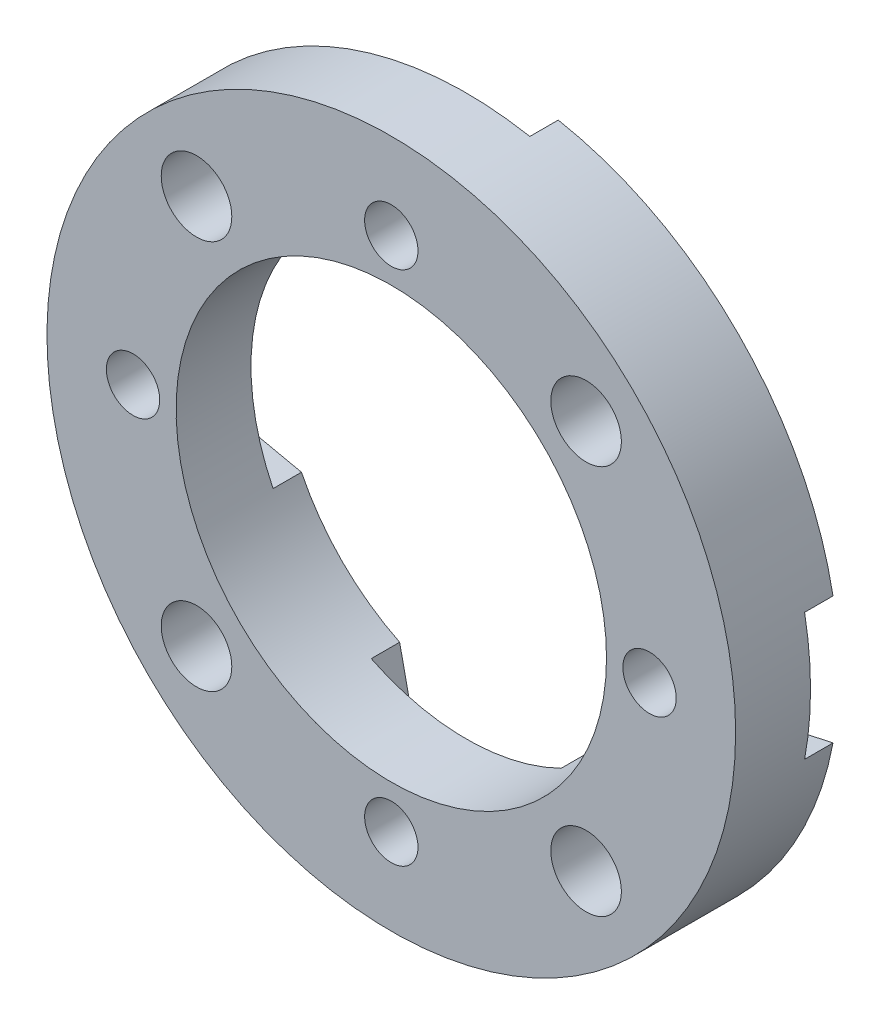
ISO-10303-21;
HEADER;
FILE_DESCRIPTION(('STEP AP214'),'2;1');
FILE_NAME('part.step','',(''),(''),'','','');
FILE_SCHEMA(('AUTOMOTIVE_DESIGN { 1 0 10303 214 1 1 1 1 }'));
ENDSEC;
DATA;
#1=APPLICATION_CONTEXT('core data for automotive mechanical design processes');
#2=APPLICATION_PROTOCOL_DEFINITION('international standard','automotive_design',2000,#1);
#3=PRODUCT_CONTEXT('',#1,'mechanical');
#4=PRODUCT('Part','Part','',(#3));
#5=PRODUCT_RELATED_PRODUCT_CATEGORY('part','',(#4));
#6=PRODUCT_DEFINITION_FORMATION('','',#4);
#7=PRODUCT_DEFINITION_CONTEXT('part definition',#1,'design');
#8=PRODUCT_DEFINITION('design','',#6,#7);
#9=PRODUCT_DEFINITION_SHAPE('','',#8);
#10=(LENGTH_UNIT() NAMED_UNIT(*) SI_UNIT(.MILLI.,.METRE.));
#11=(NAMED_UNIT(*) PLANE_ANGLE_UNIT() SI_UNIT($,.RADIAN.));
#12=(NAMED_UNIT(*) SI_UNIT($,.STERADIAN.) SOLID_ANGLE_UNIT());
#13=UNCERTAINTY_MEASURE_WITH_UNIT(LENGTH_MEASURE(1.E-05),#10,'distance_accuracy_value','');
#14=(GEOMETRIC_REPRESENTATION_CONTEXT(3) GLOBAL_UNCERTAINTY_ASSIGNED_CONTEXT((#13)) GLOBAL_UNIT_ASSIGNED_CONTEXT((#10,
#11,#12)) REPRESENTATION_CONTEXT('',''));
#15=CARTESIAN_POINT('',(0.,0.,0.));
#16=DIRECTION('',(0.,0.,1.));
#17=DIRECTION('',(1.,0.,0.));
#18=AXIS2_PLACEMENT_3D('',#15,#16,#17);
#19=CARTESIAN_POINT('',(0.,0.,6.));
#20=DIRECTION('',(0.,0.,-1.));
#21=DIRECTION('',(-1.,0.,0.));
#22=AXIS2_PLACEMENT_3D('',#19,#20,#21);
#23=CYLINDRICAL_SURFACE('',#22,20.);
#24=CARTESIAN_POINT('',(0.,0.,6.));
#25=DIRECTION('',(0.,0.,1.));
#26=DIRECTION('',(1.,0.,0.));
#27=AXIS2_PLACEMENT_3D('',#24,#25,#26);
#28=CIRCLE('',#27,20.);
#29=CARTESIAN_POINT('',(20.,0.,6.));
#30=VERTEX_POINT('',#29);
#31=EDGE_CURVE('E11',#30,#30,#28,.T.);
#32=ORIENTED_EDGE('',*,*,#31,.F.);
#33=EDGE_LOOP('',(#32));
#34=FACE_BOUND('',#33,.T.);
#35=CARTESIAN_POINT('',(0.,0.,1.65));
#36=DIRECTION('',(0.,0.,-1.));
#37=DIRECTION('',(-1.,0.,0.));
#38=AXIS2_PLACEMENT_3D('',#35,#36,#37);
#39=CIRCLE('',#38,20.);
#40=CARTESIAN_POINT('',(-19.6553049990633,-3.69715909771254,1.65));
#41=VERTEX_POINT('',#40);
#42=CARTESIAN_POINT('',(3.69715909771247,19.6553049990633,1.65));
#43=VERTEX_POINT('',#42);
#44=EDGE_CURVE('E129',#41,#43,#39,.T.);
#45=ORIENTED_EDGE('',*,*,#44,.F.);
#46=DIRECTION('',(0.,0.,-1.));
#47=VECTOR('',#46,1.);
#48=CARTESIAN_POINT('',(-19.6553049990633,-3.69715909771254,1.65));
#49=LINE('',#48,#47);
#50=CARTESIAN_POINT('',(-19.6553049990633,-3.69715909771254,0.));
#51=VERTEX_POINT('',#50);
#52=EDGE_CURVE('E155',#41,#51,#49,.T.);
#53=ORIENTED_EDGE('',*,*,#52,.T.);
#54=CARTESIAN_POINT('',(0.,0.,0.));
#55=DIRECTION('',(0.,0.,1.));
#56=DIRECTION('',(1.,0.,0.));
#57=AXIS2_PLACEMENT_3D('',#54,#55,#56);
#58=CIRCLE('',#57,20.);
#59=CARTESIAN_POINT('',(-3.69715909771233,-19.6553049990633,0.));
#60=VERTEX_POINT('',#59);
#61=EDGE_CURVE('E258',#51,#60,#58,.T.);
#62=ORIENTED_EDGE('',*,*,#61,.T.);
#63=DIRECTION('',(0.,0.,-1.));
#64=VECTOR('',#63,1.);
#65=CARTESIAN_POINT('',(-3.69715909771233,-19.6553049990633,1.65));
#66=LINE('',#65,#64);
#67=CARTESIAN_POINT('',(-3.69715909771233,-19.6553049990633,1.65));
#68=VERTEX_POINT('',#67);
#69=EDGE_CURVE('E167',#68,#60,#66,.T.);
#70=ORIENTED_EDGE('',*,*,#69,.F.);
#71=CARTESIAN_POINT('',(0.,0.,1.65));
#72=DIRECTION('',(0.,0.,-1.));
#73=DIRECTION('',(-1.,0.,0.));
#74=AXIS2_PLACEMENT_3D('',#71,#72,#73);
#75=CIRCLE('',#74,20.);
#76=CARTESIAN_POINT('',(3.69715909771261,-19.6553049990633,1.65));
#77=VERTEX_POINT('',#76);
#78=EDGE_CURVE('E158',#77,#68,#75,.T.);
#79=ORIENTED_EDGE('',*,*,#78,.F.);
#80=DIRECTION('',(0.,0.,-1.));
#81=VECTOR('',#80,1.);
#82=CARTESIAN_POINT('',(3.69715909771261,-19.6553049990633,1.65));
#83=LINE('',#82,#81);
#84=CARTESIAN_POINT('',(3.69715909771261,-19.6553049990633,0.));
#85=VERTEX_POINT('',#84);
#86=EDGE_CURVE('E154',#77,#85,#83,.T.);
#87=ORIENTED_EDGE('',*,*,#86,.T.);
#88=CARTESIAN_POINT('',(19.6553049990633,-3.69715909771226,0.));
#89=VERTEX_POINT('',#88);
#90=EDGE_CURVE('E254',#85,#89,#58,.T.);
#91=ORIENTED_EDGE('',*,*,#90,.T.);
#92=DIRECTION('',(0.,0.,-1.));
#93=VECTOR('',#92,1.);
#94=CARTESIAN_POINT('',(19.6553049990633,-3.69715909771226,1.65));
#95=LINE('',#94,#93);
#96=CARTESIAN_POINT('',(19.6553049990633,-3.69715909771226,1.65));
#97=VERTEX_POINT('',#96);
#98=EDGE_CURVE('E191',#97,#89,#95,.T.);
#99=ORIENTED_EDGE('',*,*,#98,.F.);
#100=CARTESIAN_POINT('',(0.,0.,1.65));
#101=DIRECTION('',(0.,0.,-1.));
#102=DIRECTION('',(-1.,0.,0.));
#103=AXIS2_PLACEMENT_3D('',#100,#101,#102);
#104=CIRCLE('',#103,20.);
#105=CARTESIAN_POINT('',(19.6553049990632,3.69715909771268,1.65));
#106=VERTEX_POINT('',#105);
#107=EDGE_CURVE('E180',#106,#97,#104,.T.);
#108=ORIENTED_EDGE('',*,*,#107,.F.);
#109=DIRECTION('',(0.,0.,-1.));
#110=VECTOR('',#109,1.);
#111=CARTESIAN_POINT('',(19.6553049990632,3.69715909771268,1.65));
#112=LINE('',#111,#110);
#113=CARTESIAN_POINT('',(19.6553049990632,3.69715909771268,0.));
#114=VERTEX_POINT('',#113);
#115=EDGE_CURVE('E170',#106,#114,#112,.T.);
#116=ORIENTED_EDGE('',*,*,#115,.T.);
#117=CARTESIAN_POINT('',(3.69715909771247,19.6553049990633,0.));
#118=VERTEX_POINT('',#117);
#119=EDGE_CURVE('E38',#114,#118,#58,.T.);
#120=ORIENTED_EDGE('',*,*,#119,.T.);
#121=DIRECTION('',(0.,0.,-1.));
#122=VECTOR('',#121,1.);
#123=CARTESIAN_POINT('',(3.69715909771247,19.6553049990633,1.65));
#124=LINE('',#123,#122);
#125=EDGE_CURVE('E123',#43,#118,#124,.T.);
#126=ORIENTED_EDGE('',*,*,#125,.F.);
#127=EDGE_LOOP('',(#45,#53,#62,#70,#79,#87,#91,#99,#108,#116,#120,#126));
#128=FACE_BOUND('',#127,.T.);
#129=ADVANCED_FACE('F35',(#34,#128),#23,.T.);
#130=CARTESIAN_POINT('',(-11.3137084989847,11.3137084989848,6.));
#131=DIRECTION('',(0.,0.,-1.));
#132=DIRECTION('',(-1.,0.,0.));
#133=AXIS2_PLACEMENT_3D('',#130,#131,#132);
#134=CYLINDRICAL_SURFACE('',#133,2.05);
#135=CARTESIAN_POINT('',(-11.3137084989847,11.3137084989848,6.));
#136=DIRECTION('',(0.,0.,1.));
#137=DIRECTION('',(1.,0.,0.));
#138=AXIS2_PLACEMENT_3D('',#135,#136,#137);
#139=CIRCLE('',#138,2.05);
#140=CARTESIAN_POINT('',(-9.2637084989847,11.3137084989848,6.));
#141=VERTEX_POINT('',#140);
#142=EDGE_CURVE('E249',#141,#141,#139,.T.);
#143=ORIENTED_EDGE('',*,*,#142,.T.);
#144=EDGE_LOOP('',(#143));
#145=FACE_BOUND('',#144,.T.);
#146=CARTESIAN_POINT('',(-11.3137084989847,11.3137084989848,1.65));
#147=DIRECTION('',(0.,0.,-1.));
#148=DIRECTION('',(-1.,0.,0.));
#149=AXIS2_PLACEMENT_3D('',#146,#147,#148);
#150=CIRCLE('',#149,2.05);
#151=CARTESIAN_POINT('',(-13.3637084989847,11.3137084989848,1.65));
#152=VERTEX_POINT('',#151);
#153=EDGE_CURVE('E194',#152,#152,#150,.T.);
#154=ORIENTED_EDGE('',*,*,#153,.T.);
#155=EDGE_LOOP('',(#154));
#156=FACE_BOUND('',#155,.T.);
#157=ADVANCED_FACE('F308',(#145,#156),#134,.F.);
#158=CARTESIAN_POINT('',(0.,0.,31.));
#159=DIRECTION('',(0.,0.,-1.));
#160=DIRECTION('',(-1.,0.,0.));
#161=AXIS2_PLACEMENT_3D('',#158,#159,#160);
#162=CYLINDRICAL_SURFACE('',#161,12.5);
#163=CARTESIAN_POINT('',(0.,0.,6.));
#164=DIRECTION('',(0.,0.,1.));
#165=DIRECTION('',(1.,0.,0.));
#166=AXIS2_PLACEMENT_3D('',#163,#164,#165);
#167=CIRCLE('',#166,12.5);
#168=CARTESIAN_POINT('',(12.5,0.,6.));
#169=VERTEX_POINT('',#168);
#170=EDGE_CURVE('E219',#169,#169,#167,.T.);
#171=ORIENTED_EDGE('',*,*,#170,.T.);
#172=EDGE_LOOP('',(#171));
#173=FACE_BOUND('',#172,.T.);
#174=DIRECTION('',(0.,0.,-1.));
#175=VECTOR('',#174,1.);
#176=CARTESIAN_POINT('',(-11.2173584152621,-5.51551177893292,1.65));
#177=LINE('',#176,#175);
#178=CARTESIAN_POINT('',(-11.2173584152621,-5.51551177893292,1.65));
#179=VERTEX_POINT('',#178);
#180=CARTESIAN_POINT('',(-11.2173584152621,-5.51551177893292,0.));
#181=VERTEX_POINT('',#180);
#182=EDGE_CURVE('E151',#179,#181,#177,.T.);
#183=ORIENTED_EDGE('',*,*,#182,.F.);
#184=CARTESIAN_POINT('',(0.,0.,1.65));
#185=DIRECTION('',(0.,0.,1.));
#186=DIRECTION('',(-1.,0.,0.));
#187=AXIS2_PLACEMENT_3D('',#184,#185,#186);
#188=CIRCLE('',#187,12.5);
#189=CARTESIAN_POINT('',(5.51551177893288,11.2173584152622,1.65));
#190=VERTEX_POINT('',#189);
#191=EDGE_CURVE('E128',#190,#179,#188,.T.);
#192=ORIENTED_EDGE('',*,*,#191,.F.);
#193=DIRECTION('',(0.,0.,-1.));
#194=VECTOR('',#193,1.);
#195=CARTESIAN_POINT('',(5.51551177893288,11.2173584152622,1.65));
#196=LINE('',#195,#194);
#197=CARTESIAN_POINT('',(5.51551177893288,11.2173584152622,0.));
#198=VERTEX_POINT('',#197);
#199=EDGE_CURVE('E126',#190,#198,#196,.T.);
#200=ORIENTED_EDGE('',*,*,#199,.T.);
#201=CARTESIAN_POINT('',(0.,0.,0.));
#202=DIRECTION('',(0.,0.,-1.));
#203=DIRECTION('',(-1.,0.,0.));
#204=AXIS2_PLACEMENT_3D('',#201,#202,#203);
#205=CIRCLE('',#204,12.5);
#206=CARTESIAN_POINT('',(11.2173584152621,5.51551177893299,0.));
#207=VERTEX_POINT('',#206);
#208=EDGE_CURVE('E218',#198,#207,#205,.T.);
#209=ORIENTED_EDGE('',*,*,#208,.T.);
#210=DIRECTION('',(0.,0.,-1.));
#211=VECTOR('',#210,1.);
#212=CARTESIAN_POINT('',(11.2173584152621,5.51551177893299,1.65));
#213=LINE('',#212,#211);
#214=CARTESIAN_POINT('',(11.2173584152621,5.51551177893299,1.65));
#215=VERTEX_POINT('',#214);
#216=EDGE_CURVE('E197',#215,#207,#213,.T.);
#217=ORIENTED_EDGE('',*,*,#216,.F.);
#218=CARTESIAN_POINT('',(0.,0.,1.65));
#219=DIRECTION('',(0.,0.,1.));
#220=DIRECTION('',(-1.,0.,0.));
#221=AXIS2_PLACEMENT_3D('',#218,#219,#220);
#222=CIRCLE('',#221,12.5);
#223=CARTESIAN_POINT('',(11.2173584152622,-5.51551177893276,1.65));
#224=VERTEX_POINT('',#223);
#225=EDGE_CURVE('E186',#224,#215,#222,.T.);
#226=ORIENTED_EDGE('',*,*,#225,.F.);
#227=DIRECTION('',(0.,0.,-1.));
#228=VECTOR('',#227,1.);
#229=CARTESIAN_POINT('',(11.2173584152622,-5.51551177893276,1.65));
#230=LINE('',#229,#228);
#231=CARTESIAN_POINT('',(11.2173584152622,-5.51551177893276,0.));
#232=VERTEX_POINT('',#231);
#233=EDGE_CURVE('E199',#224,#232,#230,.T.);
#234=ORIENTED_EDGE('',*,*,#233,.T.);
#235=CARTESIAN_POINT('',(5.51551177893295,-11.2173584152621,0.));
#236=VERTEX_POINT('',#235);
#237=EDGE_CURVE('E217',#232,#236,#205,.T.);
#238=ORIENTED_EDGE('',*,*,#237,.T.);
#239=DIRECTION('',(0.,0.,-1.));
#240=VECTOR('',#239,1.);
#241=CARTESIAN_POINT('',(5.51551177893295,-11.2173584152621,1.65));
#242=LINE('',#241,#240);
#243=CARTESIAN_POINT('',(5.51551177893295,-11.2173584152621,1.65));
#244=VERTEX_POINT('',#243);
#245=EDGE_CURVE('E174',#244,#236,#242,.T.);
#246=ORIENTED_EDGE('',*,*,#245,.F.);
#247=CARTESIAN_POINT('',(0.,0.,1.65));
#248=DIRECTION('',(0.,0.,1.));
#249=DIRECTION('',(-1.,0.,0.));
#250=AXIS2_PLACEMENT_3D('',#247,#248,#249);
#251=CIRCLE('',#250,12.5);
#252=CARTESIAN_POINT('',(-5.5155117789328,-11.2173584152622,1.65));
#253=VERTEX_POINT('',#252);
#254=EDGE_CURVE('E162',#253,#244,#251,.T.);
#255=ORIENTED_EDGE('',*,*,#254,.F.);
#256=DIRECTION('',(0.,0.,-1.));
#257=VECTOR('',#256,1.);
#258=CARTESIAN_POINT('',(-5.5155117789328,-11.2173584152622,1.65));
#259=LINE('',#258,#257);
#260=CARTESIAN_POINT('',(-5.5155117789328,-11.2173584152622,0.));
#261=VERTEX_POINT('',#260);
#262=EDGE_CURVE('E176',#253,#261,#259,.T.);
#263=ORIENTED_EDGE('',*,*,#262,.T.);
#264=EDGE_CURVE('E214',#261,#181,#205,.T.);
#265=ORIENTED_EDGE('',*,*,#264,.T.);
#266=EDGE_LOOP('',(#183,#192,#200,#209,#217,#226,#234,#238,#246,#255,#263,#265));
#267=FACE_BOUND('',#266,.T.);
#268=ADVANCED_FACE('F275',(#173,#267),#162,.F.);
#269=CARTESIAN_POINT('',(0.,0.,0.));
#270=DIRECTION('',(0.,0.,1.));
#271=DIRECTION('',(1.,0.,0.));
#272=AXIS2_PLACEMENT_3D('',#269,#270,#271);
#273=PLANE('',#272);
#274=CARTESIAN_POINT('',(-11.3137084989842,-11.3137084989847,0.));
#275=DIRECTION('',(0.,0.,1.));
#276=DIRECTION('',(1.,0.,0.));
#277=AXIS2_PLACEMENT_3D('',#274,#275,#276);
#278=CIRCLE('',#277,2.05000000000033);
#279=CARTESIAN_POINT('',(-9.26370849898385,-11.3137084989847,0.));
#280=VERTEX_POINT('',#279);
#281=EDGE_CURVE('E222',#280,#280,#278,.T.);
#282=ORIENTED_EDGE('',*,*,#281,.T.);
#283=EDGE_LOOP('',(#282));
#284=FACE_BOUND('',#283,.T.);
#285=ORIENTED_EDGE('',*,*,#61,.F.);
#286=DIRECTION('',(-0.977559149800929,0.21066112275521,0.));
#287=VECTOR('',#286,1.);
#288=CARTESIAN_POINT('',(-19.6553049990633,-3.69715909771254,0.));
#289=LINE('',#288,#287);
#290=EDGE_CURVE('E152',#181,#51,#289,.T.);
#291=ORIENTED_EDGE('',*,*,#290,.F.);
#292=ORIENTED_EDGE('',*,*,#264,.F.);
#293=DIRECTION('',(-0.21066112275522,0.977559149800927,0.));
#294=VECTOR('',#293,1.);
#295=CARTESIAN_POINT('',(-3.69715909771233,-19.6553049990633,0.));
#296=LINE('',#295,#294);
#297=EDGE_CURVE('E168',#60,#261,#296,.T.);
#298=ORIENTED_EDGE('',*,*,#297,.F.);
#299=EDGE_LOOP('',(#285,#291,#292,#298));
#300=FACE_BOUND('',#299,.T.);
#301=ADVANCED_FACE('F268',(#284,#300),#273,.F.);
#302=CARTESIAN_POINT('',(11.3137084989853,-11.3137084989842,0.));
#303=DIRECTION('',(0.,0.,1.));
#304=DIRECTION('',(1.,0.,0.));
#305=AXIS2_PLACEMENT_3D('',#302,#303,#304);
#306=CIRCLE('',#305,2.05000000000089);
#307=CARTESIAN_POINT('',(13.3637084989862,-11.3137084989842,0.));
#308=VERTEX_POINT('',#307);
#309=EDGE_CURVE('E226',#308,#308,#306,.T.);
#310=ORIENTED_EDGE('',*,*,#309,.T.);
#311=EDGE_LOOP('',(#310));
#312=FACE_BOUND('',#311,.T.);
#313=ORIENTED_EDGE('',*,*,#90,.F.);
#314=DIRECTION('',(-0.210661122755206,-0.97755914980093,0.));
#315=VECTOR('',#314,1.);
#316=CARTESIAN_POINT('',(3.69715909771261,-19.6553049990633,0.));
#317=LINE('',#316,#315);
#318=EDGE_CURVE('E160',#236,#85,#317,.T.);
#319=ORIENTED_EDGE('',*,*,#318,.F.);
#320=ORIENTED_EDGE('',*,*,#237,.F.);
#321=DIRECTION('',(-0.977559149800926,-0.210661122755223,0.));
#322=VECTOR('',#321,1.);
#323=CARTESIAN_POINT('',(19.6553049990633,-3.69715909771226,0.));
#324=LINE('',#323,#322);
#325=EDGE_CURVE('E192',#89,#232,#324,.T.);
#326=ORIENTED_EDGE('',*,*,#325,.F.);
#327=EDGE_LOOP('',(#313,#319,#320,#326));
#328=FACE_BOUND('',#327,.T.);
#329=ADVANCED_FACE('F285',(#312,#328),#273,.F.);
#330=CARTESIAN_POINT('',(0.,15.,6.));
#331=DIRECTION('',(0.,0.,-1.));
#332=DIRECTION('',(-1.,0.,0.));
#333=AXIS2_PLACEMENT_3D('',#330,#331,#332);
#334=CYLINDRICAL_SURFACE('',#333,1.55);
#335=CARTESIAN_POINT('',(0.,15.,6.));
#336=DIRECTION('',(0.,0.,1.));
#337=DIRECTION('',(1.,0.,0.));
#338=AXIS2_PLACEMENT_3D('',#335,#336,#337);
#339=CIRCLE('',#338,1.55);
#340=CARTESIAN_POINT('',(1.55,15.,6.));
#341=VERTEX_POINT('',#340);
#342=EDGE_CURVE('E252',#341,#341,#339,.T.);
#343=ORIENTED_EDGE('',*,*,#342,.T.);
#344=EDGE_LOOP('',(#343));
#345=FACE_BOUND('',#344,.T.);
#346=CARTESIAN_POINT('',(0.,15.,1.65));
#347=DIRECTION('',(0.,0.,-1.));
#348=DIRECTION('',(-1.,0.,0.));
#349=AXIS2_PLACEMENT_3D('',#346,#347,#348);
#350=CIRCLE('',#349,1.55);
#351=CARTESIAN_POINT('',(-1.55,15.,1.65));
#352=VERTEX_POINT('',#351);
#353=EDGE_CURVE('E211',#352,#352,#350,.T.);
#354=ORIENTED_EDGE('',*,*,#353,.T.);
#355=EDGE_LOOP('',(#354));
#356=FACE_BOUND('',#355,.T.);
#357=ADVANCED_FACE('F361',(#345,#356),#334,.F.);
#358=CARTESIAN_POINT('',(15.0000000000004,4.23570186157979E-13,6.));
#359=DIRECTION('',(0.,0.,-1.));
#360=DIRECTION('',(-1.,0.,0.));
#361=AXIS2_PLACEMENT_3D('',#358,#359,#360);
#362=CYLINDRICAL_SURFACE('',#361,1.55000000000033);
#363=CARTESIAN_POINT('',(15.0000000000004,4.23570186157979E-13,6.));
#364=DIRECTION('',(0.,0.,1.));
#365=DIRECTION('',(1.,0.,0.));
#366=AXIS2_PLACEMENT_3D('',#363,#364,#365);
#367=CIRCLE('',#366,1.55000000000033);
#368=CARTESIAN_POINT('',(16.5500000000008,4.23570186157979E-13,6.));
#369=VERTEX_POINT('',#368);
#370=EDGE_CURVE('E246',#369,#369,#367,.T.);
#371=ORIENTED_EDGE('',*,*,#370,.T.);
#372=EDGE_LOOP('',(#371));
#373=FACE_BOUND('',#372,.T.);
#374=CARTESIAN_POINT('',(15.0000000000004,4.23570186157979E-13,1.65));
#375=DIRECTION('',(0.,0.,-1.));
#376=DIRECTION('',(-1.,0.,0.));
#377=AXIS2_PLACEMENT_3D('',#374,#375,#376);
#378=CIRCLE('',#377,1.55000000000033);
#379=CARTESIAN_POINT('',(13.4500000000001,4.23570186157979E-13,1.65));
#380=VERTEX_POINT('',#379);
#381=EDGE_CURVE('E145',#380,#380,#378,.T.);
#382=ORIENTED_EDGE('',*,*,#381,.T.);
#383=EDGE_LOOP('',(#382));
#384=FACE_BOUND('',#383,.T.);
#385=ADVANCED_FACE('F327',(#373,#384),#362,.F.);
#386=CARTESIAN_POINT('',(8.47140372315957E-13,-15.,6.));
#387=DIRECTION('',(0.,0.,-1.));
#388=DIRECTION('',(-1.,0.,0.));
#389=AXIS2_PLACEMENT_3D('',#386,#387,#388);
#390=CYLINDRICAL_SURFACE('',#389,1.55000000000091);
#391=CARTESIAN_POINT('',(8.47140372315957E-13,-15.,6.));
#392=DIRECTION('',(0.,0.,1.));
#393=DIRECTION('',(1.,0.,0.));
#394=AXIS2_PLACEMENT_3D('',#391,#392,#393);
#395=CIRCLE('',#394,1.55000000000091);
#396=CARTESIAN_POINT('',(1.55000000000176,-15.,6.));
#397=VERTEX_POINT('',#396);
#398=EDGE_CURVE('E243',#397,#397,#395,.T.);
#399=ORIENTED_EDGE('',*,*,#398,.T.);
#400=EDGE_LOOP('',(#399));
#401=FACE_BOUND('',#400,.T.);
#402=CARTESIAN_POINT('',(8.47140372315957E-13,-15.,1.65));
#403=DIRECTION('',(0.,0.,-1.));
#404=DIRECTION('',(-1.,0.,0.));
#405=AXIS2_PLACEMENT_3D('',#402,#403,#404);
#406=CIRCLE('',#405,1.55000000000091);
#407=CARTESIAN_POINT('',(-1.55000000000006,-15.,1.65));
#408=VERTEX_POINT('',#407);
#409=EDGE_CURVE('E205',#408,#408,#406,.T.);
#410=ORIENTED_EDGE('',*,*,#409,.T.);
#411=EDGE_LOOP('',(#410));
#412=FACE_BOUND('',#411,.T.);
#413=ADVANCED_FACE('F318',(#401,#412),#390,.F.);
#414=CARTESIAN_POINT('',(-14.9999999999996,-4.254071563567E-13,6.));
#415=DIRECTION('',(0.,0.,-1.));
#416=DIRECTION('',(-1.,0.,0.));
#417=AXIS2_PLACEMENT_3D('',#414,#415,#416);
#418=CYLINDRICAL_SURFACE('',#417,1.55000000000068);
#419=CARTESIAN_POINT('',(-14.9999999999996,-4.254071563567E-13,6.));
#420=DIRECTION('',(0.,0.,1.));
#421=DIRECTION('',(1.,0.,0.));
#422=AXIS2_PLACEMENT_3D('',#419,#420,#421);
#423=CIRCLE('',#422,1.55000000000068);
#424=CARTESIAN_POINT('',(-13.4499999999989,-4.254071563567E-13,6.));
#425=VERTEX_POINT('',#424);
#426=EDGE_CURVE('E238',#425,#425,#423,.T.);
#427=ORIENTED_EDGE('',*,*,#426,.T.);
#428=EDGE_LOOP('',(#427));
#429=FACE_BOUND('',#428,.T.);
#430=CARTESIAN_POINT('',(-14.9999999999996,-4.254071563567E-13,1.65));
#431=DIRECTION('',(0.,0.,-1.));
#432=DIRECTION('',(-1.,0.,0.));
#433=AXIS2_PLACEMENT_3D('',#430,#431,#432);
#434=CIRCLE('',#433,1.55000000000068);
#435=CARTESIAN_POINT('',(-16.5500000000003,-4.254071563567E-13,1.65));
#436=VERTEX_POINT('',#435);
#437=EDGE_CURVE('E208',#436,#436,#434,.T.);
#438=ORIENTED_EDGE('',*,*,#437,.T.);
#439=EDGE_LOOP('',(#438));
#440=FACE_BOUND('',#439,.T.);
#441=ADVANCED_FACE('F315',(#429,#440),#418,.F.);
#442=CARTESIAN_POINT('',(0.,0.,6.));
#443=DIRECTION('',(0.,0.,1.));
#444=DIRECTION('',(1.,0.,0.));
#445=AXIS2_PLACEMENT_3D('',#442,#443,#444);
#446=PLANE('',#445);
#447=ORIENTED_EDGE('',*,*,#170,.F.);
#448=EDGE_LOOP('',(#447));
#449=FACE_BOUND('',#448,.T.);
#450=CARTESIAN_POINT('',(11.3137084989853,-11.3137084989842,6.));
#451=DIRECTION('',(0.,0.,1.));
#452=DIRECTION('',(1.,0.,0.));
#453=AXIS2_PLACEMENT_3D('',#450,#451,#452);
#454=CIRCLE('',#453,2.05000000000089);
#455=CARTESIAN_POINT('',(13.3637084989862,-11.3137084989842,6.));
#456=VERTEX_POINT('',#455);
#457=EDGE_CURVE('E229',#456,#456,#454,.T.);
#458=ORIENTED_EDGE('',*,*,#457,.F.);
#459=EDGE_LOOP('',(#458));
#460=FACE_BOUND('',#459,.T.);
#461=ORIENTED_EDGE('',*,*,#426,.F.);
#462=EDGE_LOOP('',(#461));
#463=FACE_BOUND('',#462,.T.);
#464=ORIENTED_EDGE('',*,*,#370,.F.);
#465=EDGE_LOOP('',(#464));
#466=FACE_BOUND('',#465,.T.);
#467=ORIENTED_EDGE('',*,*,#342,.F.);
#468=EDGE_LOOP('',(#467));
#469=FACE_BOUND('',#468,.T.);
#470=ORIENTED_EDGE('',*,*,#31,.T.);
#471=EDGE_LOOP('',(#470));
#472=FACE_BOUND('',#471,.T.);
#473=ORIENTED_EDGE('',*,*,#142,.F.);
#474=EDGE_LOOP('',(#473));
#475=FACE_BOUND('',#474,.T.);
#476=ORIENTED_EDGE('',*,*,#398,.F.);
#477=EDGE_LOOP('',(#476));
#478=FACE_BOUND('',#477,.T.);
#479=CARTESIAN_POINT('',(11.3137084989848,11.3137084989853,6.));
#480=DIRECTION('',(0.,0.,1.));
#481=DIRECTION('',(1.,0.,0.));
#482=AXIS2_PLACEMENT_3D('',#479,#480,#481);
#483=CIRCLE('',#482,2.05000000000066);
#484=CARTESIAN_POINT('',(13.3637084989855,11.3137084989853,6.));
#485=VERTEX_POINT('',#484);
#486=EDGE_CURVE('E235',#485,#485,#483,.T.);
#487=ORIENTED_EDGE('',*,*,#486,.F.);
#488=EDGE_LOOP('',(#487));
#489=FACE_BOUND('',#488,.T.);
#490=CARTESIAN_POINT('',(-11.3137084989842,-11.3137084989847,6.));
#491=DIRECTION('',(0.,0.,1.));
#492=DIRECTION('',(1.,0.,0.));
#493=AXIS2_PLACEMENT_3D('',#490,#491,#492);
#494=CIRCLE('',#493,2.05000000000033);
#495=CARTESIAN_POINT('',(-9.26370849898385,-11.3137084989847,6.));
#496=VERTEX_POINT('',#495);
#497=EDGE_CURVE('E223',#496,#496,#494,.T.);
#498=ORIENTED_EDGE('',*,*,#497,.F.);
#499=EDGE_LOOP('',(#498));
#500=FACE_BOUND('',#499,.T.);
#501=ADVANCED_FACE('F317',(#449,#460,#463,#466,#469,#472,#475,#478,#489,#500),#446,.T.);
#502=ORIENTED_EDGE('',*,*,#208,.F.);
#503=DIRECTION('',(0.210661122755213,-0.977559149800928,0.));
#504=VECTOR('',#503,1.);
#505=CARTESIAN_POINT('',(3.69715909771247,19.6553049990633,0.));
#506=LINE('',#505,#504);
#507=EDGE_CURVE('E139',#118,#198,#506,.T.);
#508=ORIENTED_EDGE('',*,*,#507,.F.);
#509=ORIENTED_EDGE('',*,*,#119,.F.);
#510=DIRECTION('',(0.97755914980093,-0.210661122755203,0.));
#511=VECTOR('',#510,1.);
#512=CARTESIAN_POINT('',(19.6553049990632,3.69715909771268,0.));
#513=LINE('',#512,#511);
#514=EDGE_CURVE('E184',#207,#114,#513,.T.);
#515=ORIENTED_EDGE('',*,*,#514,.F.);
#516=EDGE_LOOP('',(#502,#508,#509,#515));
#517=FACE_BOUND('',#516,.T.);
#518=CARTESIAN_POINT('',(11.3137084989848,11.3137084989853,0.));
#519=DIRECTION('',(0.,0.,1.));
#520=DIRECTION('',(1.,0.,0.));
#521=AXIS2_PLACEMENT_3D('',#518,#519,#520);
#522=CIRCLE('',#521,2.05000000000066);
#523=CARTESIAN_POINT('',(13.3637084989855,11.3137084989853,0.));
#524=VERTEX_POINT('',#523);
#525=EDGE_CURVE('E232',#524,#524,#522,.T.);
#526=ORIENTED_EDGE('',*,*,#525,.T.);
#527=EDGE_LOOP('',(#526));
#528=FACE_BOUND('',#527,.T.);
#529=ADVANCED_FACE('F302',(#517,#528),#273,.F.);
#530=CARTESIAN_POINT('',(11.3137084989848,11.3137084989853,6.));
#531=DIRECTION('',(0.,0.,-1.));
#532=DIRECTION('',(-1.,0.,0.));
#533=AXIS2_PLACEMENT_3D('',#530,#531,#532);
#534=CYLINDRICAL_SURFACE('',#533,2.05000000000066);
#535=ORIENTED_EDGE('',*,*,#486,.T.);
#536=EDGE_LOOP('',(#535));
#537=FACE_BOUND('',#536,.T.);
#538=ORIENTED_EDGE('',*,*,#525,.F.);
#539=EDGE_LOOP('',(#538));
#540=FACE_BOUND('',#539,.T.);
#541=ADVANCED_FACE('F367',(#537,#540),#534,.F.);
#542=CARTESIAN_POINT('',(11.3137084989853,-11.3137084989842,6.));
#543=DIRECTION('',(0.,0.,-1.));
#544=DIRECTION('',(-1.,0.,0.));
#545=AXIS2_PLACEMENT_3D('',#542,#543,#544);
#546=CYLINDRICAL_SURFACE('',#545,2.05000000000089);
#547=ORIENTED_EDGE('',*,*,#457,.T.);
#548=EDGE_LOOP('',(#547));
#549=FACE_BOUND('',#548,.T.);
#550=ORIENTED_EDGE('',*,*,#309,.F.);
#551=EDGE_LOOP('',(#550));
#552=FACE_BOUND('',#551,.T.);
#553=ADVANCED_FACE('F353',(#549,#552),#546,.F.);
#554=CARTESIAN_POINT('',(-11.3137084989842,-11.3137084989847,6.));
#555=DIRECTION('',(0.,0.,-1.));
#556=DIRECTION('',(-1.,0.,0.));
#557=AXIS2_PLACEMENT_3D('',#554,#555,#556);
#558=CYLINDRICAL_SURFACE('',#557,2.05000000000033);
#559=ORIENTED_EDGE('',*,*,#497,.T.);
#560=EDGE_LOOP('',(#559));
#561=FACE_BOUND('',#560,.T.);
#562=ORIENTED_EDGE('',*,*,#281,.F.);
#563=EDGE_LOOP('',(#562));
#564=FACE_BOUND('',#563,.T.);
#565=ADVANCED_FACE('F350',(#561,#564),#558,.F.);
#566=CARTESIAN_POINT('',(19.6553049990632,3.69715909771268,1.65));
#567=DIRECTION('',(0.210661122755203,0.97755914980093,0.));
#568=DIRECTION('',(-0.97755914980093,0.210661122755203,0.));
#569=AXIS2_PLACEMENT_3D('',#566,#567,#568);
#570=PLANE('',#569);
#571=ORIENTED_EDGE('',*,*,#514,.T.);
#572=ORIENTED_EDGE('',*,*,#115,.F.);
#573=DIRECTION('',(0.97755914980093,-0.210661122755203,0.));
#574=VECTOR('',#573,1.);
#575=CARTESIAN_POINT('',(19.6553049990632,3.69715909771268,1.65));
#576=LINE('',#575,#574);
#577=EDGE_CURVE('E188',#215,#106,#576,.T.);
#578=ORIENTED_EDGE('',*,*,#577,.F.);
#579=ORIENTED_EDGE('',*,*,#216,.T.);
#580=EDGE_LOOP('',(#571,#572,#578,#579));
#581=FACE_BOUND('',#580,.T.);
#582=ADVANCED_FACE('F298',(#581),#570,.F.);
#583=CARTESIAN_POINT('',(19.6553049990633,-3.69715909771226,1.65));
#584=DIRECTION('',(0.210661122755223,-0.977559149800926,0.));
#585=DIRECTION('',(0.977559149800926,0.210661122755223,0.));
#586=AXIS2_PLACEMENT_3D('',#583,#584,#585);
#587=PLANE('',#586);
#588=ORIENTED_EDGE('',*,*,#325,.T.);
#589=ORIENTED_EDGE('',*,*,#233,.F.);
#590=DIRECTION('',(-0.977559149800926,-0.210661122755223,0.));
#591=VECTOR('',#590,1.);
#592=CARTESIAN_POINT('',(19.6553049990633,-3.69715909771226,1.65));
#593=LINE('',#592,#591);
#594=EDGE_CURVE('E183',#97,#224,#593,.T.);
#595=ORIENTED_EDGE('',*,*,#594,.F.);
#596=ORIENTED_EDGE('',*,*,#98,.T.);
#597=EDGE_LOOP('',(#588,#589,#595,#596));
#598=FACE_BOUND('',#597,.T.);
#599=ADVANCED_FACE('F289',(#598),#587,.F.);
#600=CARTESIAN_POINT('',(0.,0.,1.65));
#601=DIRECTION('',(0.,0.,-1.));
#602=DIRECTION('',(-1.,0.,0.));
#603=AXIS2_PLACEMENT_3D('',#600,#601,#602);
#604=PLANE('',#603);
#605=ORIENTED_EDGE('',*,*,#381,.F.);
#606=EDGE_LOOP('',(#605));
#607=FACE_BOUND('',#606,.T.);
#608=ORIENTED_EDGE('',*,*,#107,.T.);
#609=ORIENTED_EDGE('',*,*,#594,.T.);
#610=ORIENTED_EDGE('',*,*,#225,.T.);
#611=ORIENTED_EDGE('',*,*,#577,.T.);
#612=EDGE_LOOP('',(#608,#609,#610,#611));
#613=FACE_BOUND('',#612,.T.);
#614=ADVANCED_FACE('F295',(#607,#613),#604,.T.);
#615=CARTESIAN_POINT('',(3.69715909771261,-19.6553049990633,1.65));
#616=DIRECTION('',(0.97755914980093,-0.210661122755206,0.));
#617=DIRECTION('',(0.210661122755206,0.977559149800929,0.));
#618=AXIS2_PLACEMENT_3D('',#615,#616,#617);
#619=PLANE('',#618);
#620=ORIENTED_EDGE('',*,*,#318,.T.);
#621=ORIENTED_EDGE('',*,*,#86,.F.);
#622=DIRECTION('',(-0.210661122755206,-0.97755914980093,0.));
#623=VECTOR('',#622,1.);
#624=CARTESIAN_POINT('',(3.69715909771261,-19.6553049990633,1.65));
#625=LINE('',#624,#623);
#626=EDGE_CURVE('E164',#244,#77,#625,.T.);
#627=ORIENTED_EDGE('',*,*,#626,.F.);
#628=ORIENTED_EDGE('',*,*,#245,.T.);
#629=EDGE_LOOP('',(#620,#621,#627,#628));
#630=FACE_BOUND('',#629,.T.);
#631=ADVANCED_FACE('F281',(#630),#619,.F.);
#632=CARTESIAN_POINT('',(-3.69715909771233,-19.6553049990633,1.65));
#633=DIRECTION('',(-0.977559149800927,-0.21066112275522,0.));
#634=DIRECTION('',(0.21066112275522,-0.977559149800927,0.));
#635=AXIS2_PLACEMENT_3D('',#632,#633,#634);
#636=PLANE('',#635);
#637=ORIENTED_EDGE('',*,*,#297,.T.);
#638=ORIENTED_EDGE('',*,*,#262,.F.);
#639=DIRECTION('',(-0.21066112275522,0.977559149800927,0.));
#640=VECTOR('',#639,1.);
#641=CARTESIAN_POINT('',(-3.69715909771233,-19.6553049990633,1.65));
#642=LINE('',#641,#640);
#643=EDGE_CURVE('E57',#68,#253,#642,.T.);
#644=ORIENTED_EDGE('',*,*,#643,.F.);
#645=ORIENTED_EDGE('',*,*,#69,.T.);
#646=EDGE_LOOP('',(#637,#638,#644,#645));
#647=FACE_BOUND('',#646,.T.);
#648=ADVANCED_FACE('F271',(#647),#636,.F.);
#649=CARTESIAN_POINT('',(0.,0.,1.65));
#650=DIRECTION('',(0.,0.,-1.));
#651=DIRECTION('',(-1.,0.,0.));
#652=AXIS2_PLACEMENT_3D('',#649,#650,#651);
#653=PLANE('',#652);
#654=ORIENTED_EDGE('',*,*,#409,.F.);
#655=EDGE_LOOP('',(#654));
#656=FACE_BOUND('',#655,.T.);
#657=ORIENTED_EDGE('',*,*,#78,.T.);
#658=ORIENTED_EDGE('',*,*,#643,.T.);
#659=ORIENTED_EDGE('',*,*,#254,.T.);
#660=ORIENTED_EDGE('',*,*,#626,.T.);
#661=EDGE_LOOP('',(#657,#658,#659,#660));
#662=FACE_BOUND('',#661,.T.);
#663=ADVANCED_FACE('F279',(#656,#662),#653,.T.);
#664=CARTESIAN_POINT('',(-19.6553049990633,-3.69715909771254,1.65));
#665=DIRECTION('',(-0.21066112275521,-0.977559149800929,0.));
#666=DIRECTION('',(0.977559149800929,-0.21066112275521,0.));
#667=AXIS2_PLACEMENT_3D('',#664,#665,#666);
#668=PLANE('',#667);
#669=ORIENTED_EDGE('',*,*,#290,.T.);
#670=ORIENTED_EDGE('',*,*,#52,.F.);
#671=DIRECTION('',(-0.977559149800929,0.21066112275521,0.));
#672=VECTOR('',#671,1.);
#673=CARTESIAN_POINT('',(-19.6553049990633,-3.69715909771254,1.65));
#674=LINE('',#673,#672);
#675=EDGE_CURVE('E135',#179,#41,#674,.T.);
#676=ORIENTED_EDGE('',*,*,#675,.F.);
#677=ORIENTED_EDGE('',*,*,#182,.T.);
#678=EDGE_LOOP('',(#669,#670,#676,#677));
#679=FACE_BOUND('',#678,.T.);
#680=ADVANCED_FACE('F392',(#679),#668,.F.);
#681=CARTESIAN_POINT('',(3.69715909771247,19.6553049990633,1.65));
#682=DIRECTION('',(0.977559149800928,0.210661122755213,0.));
#683=DIRECTION('',(-0.210661122755213,0.977559149800928,0.));
#684=AXIS2_PLACEMENT_3D('',#681,#682,#683);
#685=PLANE('',#684);
#686=ORIENTED_EDGE('',*,*,#507,.T.);
#687=ORIENTED_EDGE('',*,*,#199,.F.);
#688=DIRECTION('',(0.210661122755213,-0.977559149800928,0.));
#689=VECTOR('',#688,1.);
#690=CARTESIAN_POINT('',(3.69715909771247,19.6553049990633,1.65));
#691=LINE('',#690,#689);
#692=EDGE_CURVE('E49',#43,#190,#691,.T.);
#693=ORIENTED_EDGE('',*,*,#692,.F.);
#694=ORIENTED_EDGE('',*,*,#125,.T.);
#695=EDGE_LOOP('',(#686,#687,#693,#694));
#696=FACE_BOUND('',#695,.T.);
#697=ADVANCED_FACE('F121',(#696),#685,.F.);
#698=CARTESIAN_POINT('',(0.,0.,1.65));
#699=DIRECTION('',(0.,0.,-1.));
#700=DIRECTION('',(-1.,0.,0.));
#701=AXIS2_PLACEMENT_3D('',#698,#699,#700);
#702=PLANE('',#701);
#703=ORIENTED_EDGE('',*,*,#353,.F.);
#704=EDGE_LOOP('',(#703));
#705=FACE_BOUND('',#704,.T.);
#706=ORIENTED_EDGE('',*,*,#44,.T.);
#707=ORIENTED_EDGE('',*,*,#692,.T.);
#708=ORIENTED_EDGE('',*,*,#191,.T.);
#709=ORIENTED_EDGE('',*,*,#675,.T.);
#710=EDGE_LOOP('',(#706,#707,#708,#709));
#711=FACE_BOUND('',#710,.T.);
#712=ORIENTED_EDGE('',*,*,#153,.F.);
#713=EDGE_LOOP('',(#712));
#714=FACE_BOUND('',#713,.T.);
#715=ORIENTED_EDGE('',*,*,#437,.F.);
#716=EDGE_LOOP('',(#715));
#717=FACE_BOUND('',#716,.T.);
#718=ADVANCED_FACE('F132',(#705,#711,#714,#717),#702,.T.);
#719=CLOSED_SHELL('',(#129,#157,#268,#301,#329,#357,#385,#413,#441,#501,#529,#541,#553,#565,
#582,#599,#614,#631,#648,#663,#680,#697,#718));
#720=MANIFOLD_SOLID_BREP('B2',#719);
#721=ADVANCED_BREP_SHAPE_REPRESENTATION('',(#18,#720),#14);
#722=SHAPE_DEFINITION_REPRESENTATION(#9,#721);
ENDSEC;
END-ISO-10303-21;
